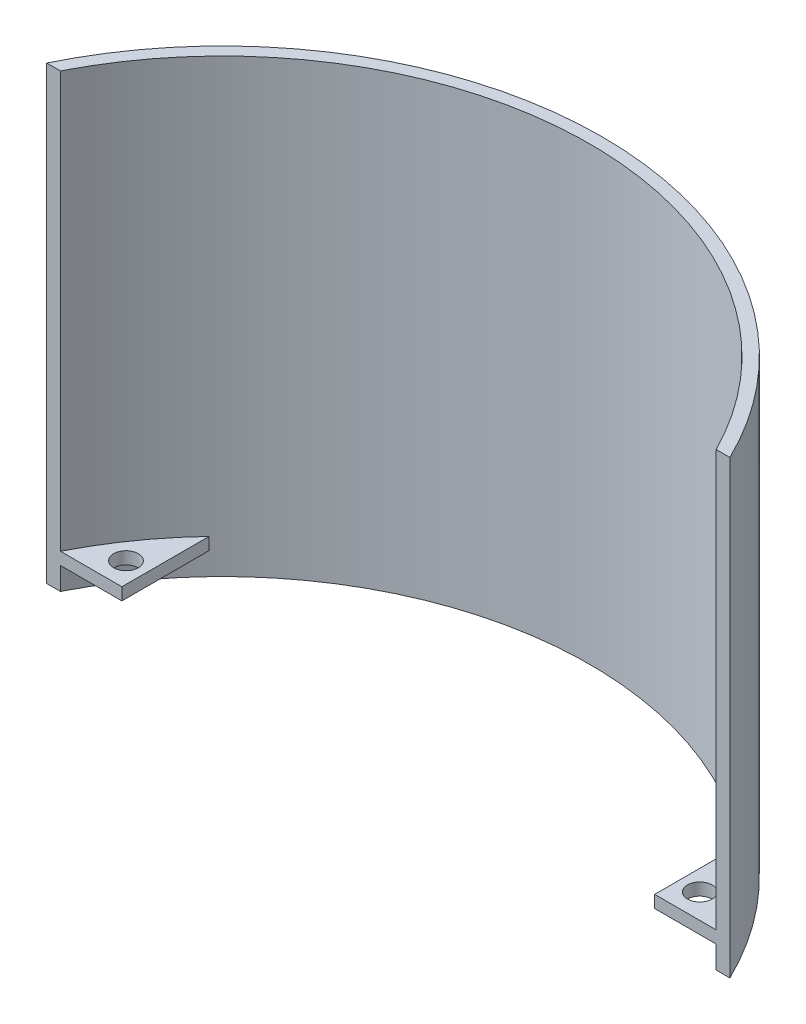
ISO-10303-21;
HEADER;
FILE_DESCRIPTION(('STEP AP214'),'2;1');
FILE_NAME('part.step','',(''),(''),'','','');
FILE_SCHEMA(('AUTOMOTIVE_DESIGN { 1 0 10303 214 1 1 1 1 }'));
ENDSEC;
DATA;
#1=APPLICATION_CONTEXT('core data for automotive mechanical design processes');
#2=APPLICATION_PROTOCOL_DEFINITION('international standard','automotive_design',2000,#1);
#3=PRODUCT_CONTEXT('',#1,'mechanical');
#4=PRODUCT('Part','Part','',(#3));
#5=PRODUCT_RELATED_PRODUCT_CATEGORY('part','',(#4));
#6=PRODUCT_DEFINITION_FORMATION('','',#4);
#7=PRODUCT_DEFINITION_CONTEXT('part definition',#1,'design');
#8=PRODUCT_DEFINITION('design','',#6,#7);
#9=PRODUCT_DEFINITION_SHAPE('','',#8);
#10=(LENGTH_UNIT() NAMED_UNIT(*) SI_UNIT(.MILLI.,.METRE.));
#11=(NAMED_UNIT(*) PLANE_ANGLE_UNIT() SI_UNIT($,.RADIAN.));
#12=(NAMED_UNIT(*) SI_UNIT($,.STERADIAN.) SOLID_ANGLE_UNIT());
#13=UNCERTAINTY_MEASURE_WITH_UNIT(LENGTH_MEASURE(1.E-05),#10,'distance_accuracy_value','');
#14=(GEOMETRIC_REPRESENTATION_CONTEXT(3) GLOBAL_UNCERTAINTY_ASSIGNED_CONTEXT((#13)) GLOBAL_UNIT_ASSIGNED_CONTEXT((#10,
#11,#12)) REPRESENTATION_CONTEXT('',''));
#15=CARTESIAN_POINT('',(0.,0.,0.));
#16=DIRECTION('',(0.,0.,1.));
#17=DIRECTION('',(1.,0.,0.));
#18=AXIS2_PLACEMENT_3D('',#15,#16,#17);
#19=CARTESIAN_POINT('',(0.,110.,0.));
#20=DIRECTION('',(0.,-1.,0.));
#21=DIRECTION('',(0.,0.,-1.));
#22=AXIS2_PLACEMENT_3D('',#19,#20,#21);
#23=CYLINDRICAL_SURFACE('',#22,89.66);
#24=DIRECTION('',(0.,-1.,0.));
#25=VECTOR('',#24,1.);
#26=CARTESIAN_POINT('',(-80.,110.,-40.4835225740053));
#27=LINE('',#26,#25);
#28=CARTESIAN_POINT('',(-80.,110.,-40.4835225740053));
#29=VERTEX_POINT('',#28);
#30=CARTESIAN_POINT('',(-80.,8.49999999999999,-40.4835225740053));
#31=VERTEX_POINT('',#30);
#32=EDGE_CURVE('E185',#29,#31,#27,.T.);
#33=ORIENTED_EDGE('',*,*,#32,.T.);
#34=CARTESIAN_POINT('',(0.,8.5,0.));
#35=DIRECTION('',(0.,1.,0.));
#36=DIRECTION('',(0.,0.,1.));
#37=AXIS2_PLACEMENT_3D('',#34,#35,#36);
#38=CIRCLE('',#37,89.66);
#39=CARTESIAN_POINT('',(-65.,8.49999999999999,-61.7569073059848));
#40=VERTEX_POINT('',#39);
#41=EDGE_CURVE('E49',#40,#31,#38,.T.);
#42=ORIENTED_EDGE('',*,*,#41,.F.);
#43=DIRECTION('',(0.,-1.,0.));
#44=VECTOR('',#43,1.);
#45=CARTESIAN_POINT('',(-65.,8.5,-61.7569073059848));
#46=LINE('',#45,#44);
#47=CARTESIAN_POINT('',(-65.,5.50000000000001,-61.7569073059848));
#48=VERTEX_POINT('',#47);
#49=EDGE_CURVE('E54',#40,#48,#46,.T.);
#50=ORIENTED_EDGE('',*,*,#49,.T.);
#51=CARTESIAN_POINT('',(0.,5.5,0.));
#52=DIRECTION('',(0.,1.,0.));
#53=DIRECTION('',(0.,0.,1.));
#54=AXIS2_PLACEMENT_3D('',#51,#52,#53);
#55=CIRCLE('',#54,89.66);
#56=CARTESIAN_POINT('',(-80.,5.5,-40.4835225740053));
#57=VERTEX_POINT('',#56);
#58=EDGE_CURVE('E134',#48,#57,#55,.T.);
#59=ORIENTED_EDGE('',*,*,#58,.T.);
#60=CARTESIAN_POINT('',(-80.,0.,-40.4835225740053));
#61=VERTEX_POINT('',#60);
#62=EDGE_CURVE('E177',#57,#61,#27,.T.);
#63=ORIENTED_EDGE('',*,*,#62,.T.);
#64=CARTESIAN_POINT('',(0.,0.,0.));
#65=DIRECTION('',(0.,-1.,0.));
#66=DIRECTION('',(0.,0.,-1.));
#67=AXIS2_PLACEMENT_3D('',#64,#65,#66);
#68=CIRCLE('',#67,89.66);
#69=CARTESIAN_POINT('',(80.,0.,-40.4835225740053));
#70=VERTEX_POINT('',#69);
#71=EDGE_CURVE('E166',#61,#70,#68,.T.);
#72=ORIENTED_EDGE('',*,*,#71,.T.);
#73=DIRECTION('',(0.,-1.,0.));
#74=VECTOR('',#73,1.);
#75=CARTESIAN_POINT('',(80.,110.,-40.4835225740053));
#76=LINE('',#75,#74);
#77=CARTESIAN_POINT('',(80.,5.50000000000001,-40.4835225740053));
#78=VERTEX_POINT('',#77);
#79=EDGE_CURVE('E42',#78,#70,#76,.T.);
#80=ORIENTED_EDGE('',*,*,#79,.F.);
#81=CARTESIAN_POINT('',(0.,5.5,0.));
#82=DIRECTION('',(0.,1.,0.));
#83=DIRECTION('',(0.,0.,1.));
#84=AXIS2_PLACEMENT_3D('',#81,#82,#83);
#85=CIRCLE('',#84,89.66);
#86=CARTESIAN_POINT('',(65.,5.5,-61.7569073059848));
#87=VERTEX_POINT('',#86);
#88=EDGE_CURVE('E143',#78,#87,#85,.T.);
#89=ORIENTED_EDGE('',*,*,#88,.T.);
#90=DIRECTION('',(0.,-1.,0.));
#91=VECTOR('',#90,1.);
#92=CARTESIAN_POINT('',(65.,8.5,-61.7569073059848));
#93=LINE('',#92,#91);
#94=CARTESIAN_POINT('',(65.,8.5,-61.7569073059848));
#95=VERTEX_POINT('',#94);
#96=EDGE_CURVE('E163',#95,#87,#93,.T.);
#97=ORIENTED_EDGE('',*,*,#96,.F.);
#98=CARTESIAN_POINT('',(0.,8.5,0.));
#99=DIRECTION('',(0.,1.,0.));
#100=DIRECTION('',(0.,0.,1.));
#101=AXIS2_PLACEMENT_3D('',#98,#99,#100);
#102=CIRCLE('',#101,89.66);
#103=CARTESIAN_POINT('',(80.,8.5,-40.4835225740053));
#104=VERTEX_POINT('',#103);
#105=EDGE_CURVE('E146',#104,#95,#102,.T.);
#106=ORIENTED_EDGE('',*,*,#105,.F.);
#107=CARTESIAN_POINT('',(80.,110.,-40.4835225740053));
#108=VERTEX_POINT('',#107);
#109=EDGE_CURVE('E11',#108,#104,#76,.T.);
#110=ORIENTED_EDGE('',*,*,#109,.F.);
#111=CARTESIAN_POINT('',(0.,110.,0.));
#112=DIRECTION('',(0.,-1.,0.));
#113=DIRECTION('',(0.,0.,-1.));
#114=AXIS2_PLACEMENT_3D('',#111,#112,#113);
#115=CIRCLE('',#114,89.66);
#116=EDGE_CURVE('E167',#29,#108,#115,.T.);
#117=ORIENTED_EDGE('',*,*,#116,.F.);
#118=EDGE_LOOP('',(#33,#42,#50,#59,#63,#72,#80,#89,#97,#106,#110,#117));
#119=FACE_BOUND('',#118,.T.);
#120=ADVANCED_FACE('F35',(#119),#23,.F.);
#121=CARTESIAN_POINT('',(80.,110.,-40.4835225740053));
#122=DIRECTION('',(0.,0.,-1.));
#123=DIRECTION('',(-1.,0.,0.));
#124=AXIS2_PLACEMENT_3D('',#121,#122,#123);
#125=PLANE('',#124);
#126=DIRECTION('',(1.,0.,0.));
#127=VECTOR('',#126,1.);
#128=CARTESIAN_POINT('',(80.,0.,-40.4835225740053));
#129=LINE('',#128,#127);
#130=CARTESIAN_POINT('',(83.3484253000619,0.,-40.4835225740053));
#131=VERTEX_POINT('',#130);
#132=EDGE_CURVE('E180',#70,#131,#129,.T.);
#133=ORIENTED_EDGE('',*,*,#132,.T.);
#134=DIRECTION('',(0.,-1.,0.));
#135=VECTOR('',#134,1.);
#136=CARTESIAN_POINT('',(83.3484253000619,110.,-40.4835225740053));
#137=LINE('',#136,#135);
#138=CARTESIAN_POINT('',(83.3484253000619,110.,-40.4835225740053));
#139=VERTEX_POINT('',#138);
#140=EDGE_CURVE('E189',#139,#131,#137,.T.);
#141=ORIENTED_EDGE('',*,*,#140,.F.);
#142=DIRECTION('',(1.,0.,0.));
#143=VECTOR('',#142,1.);
#144=CARTESIAN_POINT('',(80.,110.,-40.4835225740053));
#145=LINE('',#144,#143);
#146=EDGE_CURVE('E170',#108,#139,#145,.T.);
#147=ORIENTED_EDGE('',*,*,#146,.F.);
#148=ORIENTED_EDGE('',*,*,#109,.T.);
#149=DIRECTION('',(1.,0.,0.));
#150=VECTOR('',#149,1.);
#151=CARTESIAN_POINT('',(80.,8.5,-40.4835225740053));
#152=LINE('',#151,#150);
#153=CARTESIAN_POINT('',(65.,8.5,-40.4835225740053));
#154=VERTEX_POINT('',#153);
#155=EDGE_CURVE('E152',#154,#104,#152,.T.);
#156=ORIENTED_EDGE('',*,*,#155,.F.);
#157=DIRECTION('',(0.,-1.,0.));
#158=VECTOR('',#157,1.);
#159=CARTESIAN_POINT('',(65.,8.5,-40.4835225740053));
#160=LINE('',#159,#158);
#161=CARTESIAN_POINT('',(65.,5.5,-40.4835225740053));
#162=VERTEX_POINT('',#161);
#163=EDGE_CURVE('E154',#154,#162,#160,.T.);
#164=ORIENTED_EDGE('',*,*,#163,.T.);
#165=DIRECTION('',(1.,0.,0.));
#166=VECTOR('',#165,1.);
#167=CARTESIAN_POINT('',(80.,5.5,-40.4835225740053));
#168=LINE('',#167,#166);
#169=EDGE_CURVE('E150',#162,#78,#168,.T.);
#170=ORIENTED_EDGE('',*,*,#169,.T.);
#171=ORIENTED_EDGE('',*,*,#79,.T.);
#172=EDGE_LOOP('',(#133,#141,#147,#148,#156,#164,#170,#171));
#173=FACE_BOUND('',#172,.T.);
#174=ADVANCED_FACE('F198',(#173),#125,.F.);
#175=CARTESIAN_POINT('',(0.,110.,0.));
#176=DIRECTION('',(0.,-1.,0.));
#177=DIRECTION('',(0.,0.,-1.));
#178=AXIS2_PLACEMENT_3D('',#175,#176,#177);
#179=CYLINDRICAL_SURFACE('',#178,92.66);
#180=CARTESIAN_POINT('',(0.,0.,0.));
#181=DIRECTION('',(0.,1.,0.));
#182=DIRECTION('',(0.,0.,-1.));
#183=AXIS2_PLACEMENT_3D('',#180,#181,#182);
#184=CIRCLE('',#183,92.66);
#185=CARTESIAN_POINT('',(-83.3484253000619,0.,-40.4835225740053));
#186=VERTEX_POINT('',#185);
#187=EDGE_CURVE('E182',#131,#186,#184,.T.);
#188=ORIENTED_EDGE('',*,*,#187,.T.);
#189=DIRECTION('',(0.,-1.,0.));
#190=VECTOR('',#189,1.);
#191=CARTESIAN_POINT('',(-83.3484253000619,110.,-40.4835225740053));
#192=LINE('',#191,#190);
#193=CARTESIAN_POINT('',(-83.3484253000619,110.,-40.4835225740053));
#194=VERTEX_POINT('',#193);
#195=EDGE_CURVE('E187',#194,#186,#192,.T.);
#196=ORIENTED_EDGE('',*,*,#195,.F.);
#197=CARTESIAN_POINT('',(0.,110.,0.));
#198=DIRECTION('',(0.,1.,0.));
#199=DIRECTION('',(0.,0.,-1.));
#200=AXIS2_PLACEMENT_3D('',#197,#198,#199);
#201=CIRCLE('',#200,92.66);
#202=EDGE_CURVE('E173',#139,#194,#201,.T.);
#203=ORIENTED_EDGE('',*,*,#202,.F.);
#204=ORIENTED_EDGE('',*,*,#140,.T.);
#205=EDGE_LOOP('',(#188,#196,#203,#204));
#206=FACE_BOUND('',#205,.T.);
#207=ADVANCED_FACE('F207',(#206),#179,.T.);
#208=CARTESIAN_POINT('',(-80.,110.,-40.4835225740053));
#209=DIRECTION('',(0.,0.,-1.));
#210=DIRECTION('',(-1.,0.,0.));
#211=AXIS2_PLACEMENT_3D('',#208,#209,#210);
#212=PLANE('',#211);
#213=DIRECTION('',(1.,0.,0.));
#214=VECTOR('',#213,1.);
#215=CARTESIAN_POINT('',(-80.,0.,-40.4835225740053));
#216=LINE('',#215,#214);
#217=EDGE_CURVE('E171',#186,#61,#216,.T.);
#218=ORIENTED_EDGE('',*,*,#217,.T.);
#219=ORIENTED_EDGE('',*,*,#62,.F.);
#220=DIRECTION('',(1.,0.,0.));
#221=VECTOR('',#220,1.);
#222=CARTESIAN_POINT('',(-80.,5.5,-40.4835225740053));
#223=LINE('',#222,#221);
#224=CARTESIAN_POINT('',(-65.,5.5,-40.4835225740053));
#225=VERTEX_POINT('',#224);
#226=EDGE_CURVE('E124',#57,#225,#223,.T.);
#227=ORIENTED_EDGE('',*,*,#226,.T.);
#228=DIRECTION('',(0.,-1.,0.));
#229=VECTOR('',#228,1.);
#230=CARTESIAN_POINT('',(-65.,8.5,-40.4835225740053));
#231=LINE('',#230,#229);
#232=CARTESIAN_POINT('',(-65.,8.5,-40.4835225740053));
#233=VERTEX_POINT('',#232);
#234=EDGE_CURVE('E120',#233,#225,#231,.T.);
#235=ORIENTED_EDGE('',*,*,#234,.F.);
#236=DIRECTION('',(1.,0.,0.));
#237=VECTOR('',#236,1.);
#238=CARTESIAN_POINT('',(-80.,8.5,-40.4835225740053));
#239=LINE('',#238,#237);
#240=EDGE_CURVE('E110',#31,#233,#239,.T.);
#241=ORIENTED_EDGE('',*,*,#240,.F.);
#242=ORIENTED_EDGE('',*,*,#32,.F.);
#243=DIRECTION('',(1.,0.,0.));
#244=VECTOR('',#243,1.);
#245=CARTESIAN_POINT('',(-80.,110.,-40.4835225740053));
#246=LINE('',#245,#244);
#247=EDGE_CURVE('E175',#194,#29,#246,.T.);
#248=ORIENTED_EDGE('',*,*,#247,.F.);
#249=ORIENTED_EDGE('',*,*,#195,.T.);
#250=EDGE_LOOP('',(#218,#219,#227,#235,#241,#242,#248,#249));
#251=FACE_BOUND('',#250,.T.);
#252=ADVANCED_FACE('F122',(#251),#212,.F.);
#253=CARTESIAN_POINT('',(0.,110.,0.));
#254=DIRECTION('',(0.,-1.,0.));
#255=DIRECTION('',(0.,0.,-1.));
#256=AXIS2_PLACEMENT_3D('',#253,#254,#255);
#257=PLANE('',#256);
#258=ORIENTED_EDGE('',*,*,#116,.T.);
#259=ORIENTED_EDGE('',*,*,#146,.T.);
#260=ORIENTED_EDGE('',*,*,#202,.T.);
#261=ORIENTED_EDGE('',*,*,#247,.T.);
#262=EDGE_LOOP('',(#258,#259,#260,#261));
#263=FACE_BOUND('',#262,.T.);
#264=ADVANCED_FACE('F209',(#263),#257,.F.);
#265=CARTESIAN_POINT('',(0.,0.,0.));
#266=DIRECTION('',(0.,-1.,0.));
#267=DIRECTION('',(0.,0.,-1.));
#268=AXIS2_PLACEMENT_3D('',#265,#266,#267);
#269=PLANE('',#268);
#270=ORIENTED_EDGE('',*,*,#71,.F.);
#271=ORIENTED_EDGE('',*,*,#217,.F.);
#272=ORIENTED_EDGE('',*,*,#187,.F.);
#273=ORIENTED_EDGE('',*,*,#132,.F.);
#274=EDGE_LOOP('',(#270,#271,#272,#273));
#275=FACE_BOUND('',#274,.T.);
#276=ADVANCED_FACE('F202',(#275),#269,.T.);
#277=CARTESIAN_POINT('',(0.,8.5,0.));
#278=DIRECTION('',(0.,1.,0.));
#279=DIRECTION('',(0.,0.,1.));
#280=AXIS2_PLACEMENT_3D('',#277,#278,#279);
#281=PLANE('',#280);
#282=ORIENTED_EDGE('',*,*,#105,.T.);
#283=DIRECTION('',(0.,0.,1.));
#284=VECTOR('',#283,1.);
#285=CARTESIAN_POINT('',(65.,8.5,-40.4835225740053));
#286=LINE('',#285,#284);
#287=EDGE_CURVE('E149',#95,#154,#286,.T.);
#288=ORIENTED_EDGE('',*,*,#287,.T.);
#289=ORIENTED_EDGE('',*,*,#155,.T.);
#290=EDGE_LOOP('',(#282,#288,#289));
#291=FACE_BOUND('',#290,.T.);
#292=CARTESIAN_POINT('',(70.,8.5,-46.4835225740053));
#293=DIRECTION('',(0.,1.,0.));
#294=DIRECTION('',(0.,0.,1.));
#295=AXIS2_PLACEMENT_3D('',#292,#293,#294);
#296=CIRCLE('',#295,3.00000000000001);
#297=CARTESIAN_POINT('',(70.,8.5,-43.4835225740053));
#298=VERTEX_POINT('',#297);
#299=EDGE_CURVE('E140',#298,#298,#296,.T.);
#300=ORIENTED_EDGE('',*,*,#299,.F.);
#301=EDGE_LOOP('',(#300));
#302=FACE_BOUND('',#301,.T.);
#303=ADVANCED_FACE('F216',(#291,#302),#281,.T.);
#304=CARTESIAN_POINT('',(0.,5.5,0.));
#305=DIRECTION('',(0.,1.,0.));
#306=DIRECTION('',(0.,0.,1.));
#307=AXIS2_PLACEMENT_3D('',#304,#305,#306);
#308=PLANE('',#307);
#309=ORIENTED_EDGE('',*,*,#88,.F.);
#310=ORIENTED_EDGE('',*,*,#169,.F.);
#311=DIRECTION('',(0.,0.,1.));
#312=VECTOR('',#311,1.);
#313=CARTESIAN_POINT('',(65.,5.5,-40.4835225740053));
#314=LINE('',#313,#312);
#315=EDGE_CURVE('E157',#87,#162,#314,.T.);
#316=ORIENTED_EDGE('',*,*,#315,.F.);
#317=EDGE_LOOP('',(#309,#310,#316));
#318=FACE_BOUND('',#317,.T.);
#319=CARTESIAN_POINT('',(70.,5.5,-46.4835225740053));
#320=DIRECTION('',(0.,1.,0.));
#321=DIRECTION('',(0.,0.,1.));
#322=AXIS2_PLACEMENT_3D('',#319,#320,#321);
#323=CIRCLE('',#322,3.00000000000001);
#324=CARTESIAN_POINT('',(70.,5.5,-43.4835225740053));
#325=VERTEX_POINT('',#324);
#326=EDGE_CURVE('E127',#325,#325,#323,.T.);
#327=ORIENTED_EDGE('',*,*,#326,.T.);
#328=EDGE_LOOP('',(#327));
#329=FACE_BOUND('',#328,.T.);
#330=ADVANCED_FACE('F222',(#318,#329),#308,.F.);
#331=CARTESIAN_POINT('',(65.,8.5,-40.4835225740053));
#332=DIRECTION('',(1.,0.,0.));
#333=DIRECTION('',(0.,0.,-1.));
#334=AXIS2_PLACEMENT_3D('',#331,#332,#333);
#335=PLANE('',#334);
#336=ORIENTED_EDGE('',*,*,#315,.T.);
#337=ORIENTED_EDGE('',*,*,#163,.F.);
#338=ORIENTED_EDGE('',*,*,#287,.F.);
#339=ORIENTED_EDGE('',*,*,#96,.T.);
#340=EDGE_LOOP('',(#336,#337,#338,#339));
#341=FACE_BOUND('',#340,.T.);
#342=ADVANCED_FACE('F220',(#341),#335,.F.);
#343=CARTESIAN_POINT('',(70.,8.5,-46.4835225740053));
#344=DIRECTION('',(0.,-1.,0.));
#345=DIRECTION('',(0.,0.,-1.));
#346=AXIS2_PLACEMENT_3D('',#343,#344,#345);
#347=CYLINDRICAL_SURFACE('',#346,3.00000000000001);
#348=ORIENTED_EDGE('',*,*,#299,.T.);
#349=EDGE_LOOP('',(#348));
#350=FACE_BOUND('',#349,.T.);
#351=ORIENTED_EDGE('',*,*,#326,.F.);
#352=EDGE_LOOP('',(#351));
#353=FACE_BOUND('',#352,.T.);
#354=ADVANCED_FACE('F228',(#350,#353),#347,.F.);
#355=CARTESIAN_POINT('',(0.,8.5,0.));
#356=DIRECTION('',(0.,1.,0.));
#357=DIRECTION('',(0.,0.,1.));
#358=AXIS2_PLACEMENT_3D('',#355,#356,#357);
#359=PLANE('',#358);
#360=ORIENTED_EDGE('',*,*,#41,.T.);
#361=ORIENTED_EDGE('',*,*,#240,.T.);
#362=DIRECTION('',(0.,0.,-1.));
#363=VECTOR('',#362,1.);
#364=CARTESIAN_POINT('',(-65.,8.5,-40.4835225740053));
#365=LINE('',#364,#363);
#366=EDGE_CURVE('E115',#233,#40,#365,.T.);
#367=ORIENTED_EDGE('',*,*,#366,.T.);
#368=EDGE_LOOP('',(#360,#361,#367));
#369=FACE_BOUND('',#368,.T.);
#370=CARTESIAN_POINT('',(-70.,8.5,-46.4835225740053));
#371=DIRECTION('',(0.,1.,0.));
#372=DIRECTION('',(0.,0.,1.));
#373=AXIS2_PLACEMENT_3D('',#370,#371,#372);
#374=CIRCLE('',#373,3.00000000000001);
#375=CARTESIAN_POINT('',(-70.,8.5,-43.4835225740053));
#376=VERTEX_POINT('',#375);
#377=EDGE_CURVE('E136',#376,#376,#374,.T.);
#378=ORIENTED_EDGE('',*,*,#377,.F.);
#379=EDGE_LOOP('',(#378));
#380=FACE_BOUND('',#379,.T.);
#381=ADVANCED_FACE('F112',(#369,#380),#359,.T.);
#382=CARTESIAN_POINT('',(0.,5.5,0.));
#383=DIRECTION('',(0.,1.,0.));
#384=DIRECTION('',(0.,0.,1.));
#385=AXIS2_PLACEMENT_3D('',#382,#383,#384);
#386=PLANE('',#385);
#387=ORIENTED_EDGE('',*,*,#58,.F.);
#388=DIRECTION('',(0.,0.,-1.));
#389=VECTOR('',#388,1.);
#390=CARTESIAN_POINT('',(-65.,5.5,-40.4835225740053));
#391=LINE('',#390,#389);
#392=EDGE_CURVE('E138',#225,#48,#391,.T.);
#393=ORIENTED_EDGE('',*,*,#392,.F.);
#394=ORIENTED_EDGE('',*,*,#226,.F.);
#395=EDGE_LOOP('',(#387,#393,#394));
#396=FACE_BOUND('',#395,.T.);
#397=CARTESIAN_POINT('',(-70.,5.5,-46.4835225740053));
#398=DIRECTION('',(0.,1.,0.));
#399=DIRECTION('',(0.,0.,1.));
#400=AXIS2_PLACEMENT_3D('',#397,#398,#399);
#401=CIRCLE('',#400,3.00000000000001);
#402=CARTESIAN_POINT('',(-70.,5.5,-43.4835225740053));
#403=VERTEX_POINT('',#402);
#404=EDGE_CURVE('E314',#403,#403,#401,.T.);
#405=ORIENTED_EDGE('',*,*,#404,.T.);
#406=EDGE_LOOP('',(#405));
#407=FACE_BOUND('',#406,.T.);
#408=ADVANCED_FACE('F236',(#396,#407),#386,.F.);
#409=CARTESIAN_POINT('',(-65.,8.5,-40.4835225740053));
#410=DIRECTION('',(-1.,0.,0.));
#411=DIRECTION('',(0.,0.,1.));
#412=AXIS2_PLACEMENT_3D('',#409,#410,#411);
#413=PLANE('',#412);
#414=ORIENTED_EDGE('',*,*,#392,.T.);
#415=ORIENTED_EDGE('',*,*,#49,.F.);
#416=ORIENTED_EDGE('',*,*,#366,.F.);
#417=ORIENTED_EDGE('',*,*,#234,.T.);
#418=EDGE_LOOP('',(#414,#415,#416,#417));
#419=FACE_BOUND('',#418,.T.);
#420=ADVANCED_FACE('F129',(#419),#413,.F.);
#421=CARTESIAN_POINT('',(-70.,8.5,-46.4835225740053));
#422=DIRECTION('',(0.,-1.,0.));
#423=DIRECTION('',(0.,0.,-1.));
#424=AXIS2_PLACEMENT_3D('',#421,#422,#423);
#425=CYLINDRICAL_SURFACE('',#424,3.00000000000001);
#426=ORIENTED_EDGE('',*,*,#377,.T.);
#427=EDGE_LOOP('',(#426));
#428=FACE_BOUND('',#427,.T.);
#429=ORIENTED_EDGE('',*,*,#404,.F.);
#430=EDGE_LOOP('',(#429));
#431=FACE_BOUND('',#430,.T.);
#432=ADVANCED_FACE('F297',(#428,#431),#425,.F.);
#433=CLOSED_SHELL('',(#120,#174,#207,#252,#264,#276,#303,#330,#342,#354,#381,#408,#420,#432));
#434=MANIFOLD_SOLID_BREP('B2',#433);
#435=ADVANCED_BREP_SHAPE_REPRESENTATION('',(#18,#434),#14);
#436=SHAPE_DEFINITION_REPRESENTATION(#9,#435);
ENDSEC;
END-ISO-10303-21;
